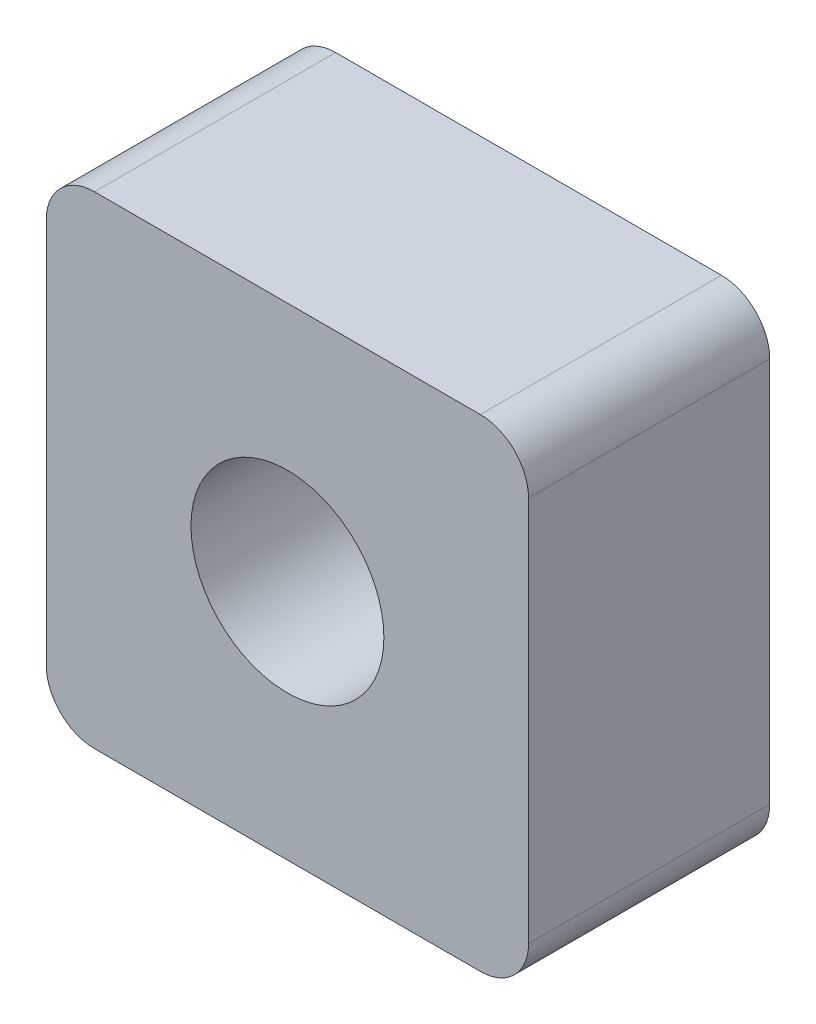
ISO-10303-21;
HEADER;
FILE_DESCRIPTION(('STEP AP214'),'2;1');
FILE_NAME('part.step','',(''),(''),'','','');
FILE_SCHEMA(('AUTOMOTIVE_DESIGN { 1 0 10303 214 1 1 1 1 }'));
ENDSEC;
DATA;
#1=APPLICATION_CONTEXT('core data for automotive mechanical design processes');
#2=APPLICATION_PROTOCOL_DEFINITION('international standard','automotive_design',2000,#1);
#3=PRODUCT_CONTEXT('',#1,'mechanical');
#4=PRODUCT('Part','Part','',(#3));
#5=PRODUCT_RELATED_PRODUCT_CATEGORY('part','',(#4));
#6=PRODUCT_DEFINITION_FORMATION('','',#4);
#7=PRODUCT_DEFINITION_CONTEXT('part definition',#1,'design');
#8=PRODUCT_DEFINITION('design','',#6,#7);
#9=PRODUCT_DEFINITION_SHAPE('','',#8);
#10=(LENGTH_UNIT() NAMED_UNIT(*) SI_UNIT(.MILLI.,.METRE.));
#11=(NAMED_UNIT(*) PLANE_ANGLE_UNIT() SI_UNIT($,.RADIAN.));
#12=(NAMED_UNIT(*) SI_UNIT($,.STERADIAN.) SOLID_ANGLE_UNIT());
#13=UNCERTAINTY_MEASURE_WITH_UNIT(LENGTH_MEASURE(1.E-05),#10,'distance_accuracy_value','');
#14=(GEOMETRIC_REPRESENTATION_CONTEXT(3) GLOBAL_UNCERTAINTY_ASSIGNED_CONTEXT((#13)) GLOBAL_UNIT_ASSIGNED_CONTEXT((#10,
#11,#12)) REPRESENTATION_CONTEXT('',''));
#15=CARTESIAN_POINT('',(0.,0.,0.));
#16=DIRECTION('',(0.,0.,1.));
#17=DIRECTION('',(1.,0.,0.));
#18=AXIS2_PLACEMENT_3D('',#15,#16,#17);
#19=CARTESIAN_POINT('',(0.,0.,10.));
#20=DIRECTION('',(0.,0.,1.));
#21=DIRECTION('',(1.,0.,0.));
#22=AXIS2_PLACEMENT_3D('',#19,#20,#21);
#23=PLANE('',#22);
#24=CARTESIAN_POINT('',(0.,0.,10.));
#25=DIRECTION('',(0.,0.,1.));
#26=DIRECTION('',(1.,0.,0.));
#27=AXIS2_PLACEMENT_3D('',#24,#25,#26);
#28=CIRCLE('',#27,4.);
#29=CARTESIAN_POINT('',(4.,0.,10.));
#30=VERTEX_POINT('',#29);
#31=EDGE_CURVE('E129',#30,#30,#28,.F.);
#32=ORIENTED_EDGE('',*,*,#31,.T.);
#33=EDGE_LOOP('',(#32));
#34=FACE_BOUND('',#33,.T.);
#35=DIRECTION('',(1.,0.,0.));
#36=VECTOR('',#35,1.);
#37=CARTESIAN_POINT('',(8.,-10.,10.));
#38=LINE('',#37,#36);
#39=CARTESIAN_POINT('',(8.,-10.,10.));
#40=VERTEX_POINT('',#39);
#41=CARTESIAN_POINT('',(-8.,-10.,10.));
#42=VERTEX_POINT('',#41);
#43=EDGE_CURVE('E113',#40,#42,#38,.F.);
#44=ORIENTED_EDGE('',*,*,#43,.F.);
#45=CARTESIAN_POINT('',(8.,-8.,10.));
#46=DIRECTION('',(0.,0.,1.));
#47=DIRECTION('',(1.,0.,0.));
#48=AXIS2_PLACEMENT_3D('',#45,#46,#47);
#49=CIRCLE('',#48,2.);
#50=CARTESIAN_POINT('',(10.,-8.,10.));
#51=VERTEX_POINT('',#50);
#52=EDGE_CURVE('E134',#51,#40,#49,.F.);
#53=ORIENTED_EDGE('',*,*,#52,.F.);
#54=DIRECTION('',(0.,1.,0.));
#55=VECTOR('',#54,1.);
#56=CARTESIAN_POINT('',(10.,8.,10.));
#57=LINE('',#56,#55);
#58=CARTESIAN_POINT('',(10.,8.,10.));
#59=VERTEX_POINT('',#58);
#60=EDGE_CURVE('E109',#59,#51,#57,.F.);
#61=ORIENTED_EDGE('',*,*,#60,.F.);
#62=CARTESIAN_POINT('',(8.,8.,10.));
#63=DIRECTION('',(0.,0.,1.));
#64=DIRECTION('',(1.,0.,0.));
#65=AXIS2_PLACEMENT_3D('',#62,#63,#64);
#66=CIRCLE('',#65,2.);
#67=CARTESIAN_POINT('',(8.,10.,10.));
#68=VERTEX_POINT('',#67);
#69=EDGE_CURVE('E96',#68,#59,#66,.F.);
#70=ORIENTED_EDGE('',*,*,#69,.F.);
#71=DIRECTION('',(1.,0.,0.));
#72=VECTOR('',#71,1.);
#73=CARTESIAN_POINT('',(-8.,10.,10.));
#74=LINE('',#73,#72);
#75=CARTESIAN_POINT('',(-8.,10.,10.));
#76=VERTEX_POINT('',#75);
#77=EDGE_CURVE('E92',#76,#68,#74,.T.);
#78=ORIENTED_EDGE('',*,*,#77,.F.);
#79=CARTESIAN_POINT('',(-8.,8.,10.));
#80=DIRECTION('',(0.,0.,1.));
#81=DIRECTION('',(1.,0.,0.));
#82=AXIS2_PLACEMENT_3D('',#79,#80,#81);
#83=CIRCLE('',#82,2.);
#84=CARTESIAN_POINT('',(-10.,8.,10.));
#85=VERTEX_POINT('',#84);
#86=EDGE_CURVE('E20',#85,#76,#83,.F.);
#87=ORIENTED_EDGE('',*,*,#86,.F.);
#88=DIRECTION('',(0.,1.,0.));
#89=VECTOR('',#88,1.);
#90=CARTESIAN_POINT('',(-10.,-8.,10.));
#91=LINE('',#90,#89);
#92=CARTESIAN_POINT('',(-10.,-8.,10.));
#93=VERTEX_POINT('',#92);
#94=EDGE_CURVE('E79',#93,#85,#91,.T.);
#95=ORIENTED_EDGE('',*,*,#94,.F.);
#96=CARTESIAN_POINT('',(-8.,-8.,10.));
#97=DIRECTION('',(0.,0.,1.));
#98=DIRECTION('',(1.,0.,0.));
#99=AXIS2_PLACEMENT_3D('',#96,#97,#98);
#100=CIRCLE('',#99,2.);
#101=EDGE_CURVE('E135',#42,#93,#100,.F.);
#102=ORIENTED_EDGE('',*,*,#101,.F.);
#103=EDGE_LOOP('',(#44,#53,#61,#70,#78,#87,#95,#102));
#104=FACE_BOUND('',#103,.T.);
#105=ADVANCED_FACE('F17',(#34,#104),#23,.T.);
#106=CARTESIAN_POINT('',(-8.,10.,0.));
#107=DIRECTION('',(0.,1.,0.));
#108=DIRECTION('',(0.,0.,1.));
#109=AXIS2_PLACEMENT_3D('',#106,#107,#108);
#110=PLANE('',#109);
#111=DIRECTION('',(1.,0.,0.));
#112=VECTOR('',#111,1.);
#113=CARTESIAN_POINT('',(0.,10.,0.));
#114=LINE('',#113,#112);
#115=CARTESIAN_POINT('',(8.,10.,0.));
#116=VERTEX_POINT('',#115);
#117=CARTESIAN_POINT('',(-8.,10.,0.));
#118=VERTEX_POINT('',#117);
#119=EDGE_CURVE('E103',#116,#118,#114,.F.);
#120=ORIENTED_EDGE('',*,*,#119,.T.);
#121=DIRECTION('',(0.,0.,1.));
#122=VECTOR('',#121,1.);
#123=CARTESIAN_POINT('',(-8.,10.,0.));
#124=LINE('',#123,#122);
#125=EDGE_CURVE('E88',#76,#118,#124,.F.);
#126=ORIENTED_EDGE('',*,*,#125,.F.);
#127=ORIENTED_EDGE('',*,*,#77,.T.);
#128=DIRECTION('',(0.,0.,1.));
#129=VECTOR('',#128,1.);
#130=CARTESIAN_POINT('',(8.,10.,0.));
#131=LINE('',#130,#129);
#132=EDGE_CURVE('E132',#116,#68,#131,.T.);
#133=ORIENTED_EDGE('',*,*,#132,.F.);
#134=EDGE_LOOP('',(#120,#126,#127,#133));
#135=FACE_BOUND('',#134,.T.);
#136=ADVANCED_FACE('F102',(#135),#110,.T.);
#137=CARTESIAN_POINT('',(-8.,8.,0.));
#138=DIRECTION('',(0.,0.,1.));
#139=DIRECTION('',(1.,0.,0.));
#140=AXIS2_PLACEMENT_3D('',#137,#138,#139);
#141=CYLINDRICAL_SURFACE('',#140,2.);
#142=CARTESIAN_POINT('',(-8.,8.,0.));
#143=DIRECTION('',(0.,0.,1.));
#144=DIRECTION('',(1.,0.,0.));
#145=AXIS2_PLACEMENT_3D('',#142,#143,#144);
#146=CIRCLE('',#145,2.);
#147=CARTESIAN_POINT('',(-10.,8.,0.));
#148=VERTEX_POINT('',#147);
#149=EDGE_CURVE('E127',#118,#148,#146,.T.);
#150=ORIENTED_EDGE('',*,*,#149,.T.);
#151=DIRECTION('',(0.,0.,1.));
#152=VECTOR('',#151,1.);
#153=CARTESIAN_POINT('',(-10.,8.,0.));
#154=LINE('',#153,#152);
#155=EDGE_CURVE('E90',#85,#148,#154,.F.);
#156=ORIENTED_EDGE('',*,*,#155,.F.);
#157=ORIENTED_EDGE('',*,*,#86,.T.);
#158=ORIENTED_EDGE('',*,*,#125,.T.);
#159=EDGE_LOOP('',(#150,#156,#157,#158));
#160=FACE_BOUND('',#159,.T.);
#161=ADVANCED_FACE('F86',(#160),#141,.T.);
#162=CARTESIAN_POINT('',(-10.,-8.,0.));
#163=DIRECTION('',(-1.,0.,0.));
#164=DIRECTION('',(0.,0.,1.));
#165=AXIS2_PLACEMENT_3D('',#162,#163,#164);
#166=PLANE('',#165);
#167=DIRECTION('',(0.,1.,0.));
#168=VECTOR('',#167,1.);
#169=CARTESIAN_POINT('',(-10.,0.,0.));
#170=LINE('',#169,#168);
#171=CARTESIAN_POINT('',(-10.,-8.,0.));
#172=VERTEX_POINT('',#171);
#173=EDGE_CURVE('E126',#148,#172,#170,.F.);
#174=ORIENTED_EDGE('',*,*,#173,.T.);
#175=DIRECTION('',(0.,0.,1.));
#176=VECTOR('',#175,1.);
#177=CARTESIAN_POINT('',(-10.,-8.,0.));
#178=LINE('',#177,#176);
#179=EDGE_CURVE('E115',#93,#172,#178,.F.);
#180=ORIENTED_EDGE('',*,*,#179,.F.);
#181=ORIENTED_EDGE('',*,*,#94,.T.);
#182=ORIENTED_EDGE('',*,*,#155,.T.);
#183=EDGE_LOOP('',(#174,#180,#181,#182));
#184=FACE_BOUND('',#183,.T.);
#185=ADVANCED_FACE('F141',(#184),#166,.T.);
#186=CARTESIAN_POINT('',(-8.,-8.,0.));
#187=DIRECTION('',(0.,0.,1.));
#188=DIRECTION('',(1.,0.,0.));
#189=AXIS2_PLACEMENT_3D('',#186,#187,#188);
#190=CYLINDRICAL_SURFACE('',#189,2.);
#191=CARTESIAN_POINT('',(-8.,-8.,0.));
#192=DIRECTION('',(0.,0.,1.));
#193=DIRECTION('',(1.,0.,0.));
#194=AXIS2_PLACEMENT_3D('',#191,#192,#193);
#195=CIRCLE('',#194,2.);
#196=CARTESIAN_POINT('',(-8.,-10.,0.));
#197=VERTEX_POINT('',#196);
#198=EDGE_CURVE('E123',#172,#197,#195,.T.);
#199=ORIENTED_EDGE('',*,*,#198,.T.);
#200=DIRECTION('',(0.,0.,-1.));
#201=VECTOR('',#200,1.);
#202=CARTESIAN_POINT('',(-8.,-10.,0.));
#203=LINE('',#202,#201);
#204=EDGE_CURVE('E114',#42,#197,#203,.T.);
#205=ORIENTED_EDGE('',*,*,#204,.F.);
#206=ORIENTED_EDGE('',*,*,#101,.T.);
#207=ORIENTED_EDGE('',*,*,#179,.T.);
#208=EDGE_LOOP('',(#199,#205,#206,#207));
#209=FACE_BOUND('',#208,.T.);
#210=ADVANCED_FACE('F161',(#209),#190,.T.);
#211=CARTESIAN_POINT('',(8.,-10.,0.));
#212=DIRECTION('',(0.,-1.,0.));
#213=DIRECTION('',(0.,0.,-1.));
#214=AXIS2_PLACEMENT_3D('',#211,#212,#213);
#215=PLANE('',#214);
#216=DIRECTION('',(1.,0.,0.));
#217=VECTOR('',#216,1.);
#218=CARTESIAN_POINT('',(0.,-10.,0.));
#219=LINE('',#218,#217);
#220=CARTESIAN_POINT('',(8.,-10.,0.));
#221=VERTEX_POINT('',#220);
#222=EDGE_CURVE('E122',#197,#221,#219,.T.);
#223=ORIENTED_EDGE('',*,*,#222,.T.);
#224=DIRECTION('',(0.,0.,1.));
#225=VECTOR('',#224,1.);
#226=CARTESIAN_POINT('',(8.,-10.,0.));
#227=LINE('',#226,#225);
#228=EDGE_CURVE('E112',#40,#221,#227,.F.);
#229=ORIENTED_EDGE('',*,*,#228,.F.);
#230=ORIENTED_EDGE('',*,*,#43,.T.);
#231=ORIENTED_EDGE('',*,*,#204,.T.);
#232=EDGE_LOOP('',(#223,#229,#230,#231));
#233=FACE_BOUND('',#232,.T.);
#234=ADVANCED_FACE('F158',(#233),#215,.T.);
#235=CARTESIAN_POINT('',(8.,-8.,0.));
#236=DIRECTION('',(0.,0.,1.));
#237=DIRECTION('',(1.,0.,0.));
#238=AXIS2_PLACEMENT_3D('',#235,#236,#237);
#239=CYLINDRICAL_SURFACE('',#238,2.);
#240=CARTESIAN_POINT('',(8.,-8.,0.));
#241=DIRECTION('',(0.,0.,1.));
#242=DIRECTION('',(1.,0.,0.));
#243=AXIS2_PLACEMENT_3D('',#240,#241,#242);
#244=CIRCLE('',#243,2.);
#245=CARTESIAN_POINT('',(10.,-8.,0.));
#246=VERTEX_POINT('',#245);
#247=EDGE_CURVE('E119',#221,#246,#244,.T.);
#248=ORIENTED_EDGE('',*,*,#247,.T.);
#249=DIRECTION('',(0.,0.,-1.));
#250=VECTOR('',#249,1.);
#251=CARTESIAN_POINT('',(10.,-8.,0.));
#252=LINE('',#251,#250);
#253=EDGE_CURVE('E111',#51,#246,#252,.T.);
#254=ORIENTED_EDGE('',*,*,#253,.F.);
#255=ORIENTED_EDGE('',*,*,#52,.T.);
#256=ORIENTED_EDGE('',*,*,#228,.T.);
#257=EDGE_LOOP('',(#248,#254,#255,#256));
#258=FACE_BOUND('',#257,.T.);
#259=ADVANCED_FACE('F169',(#258),#239,.T.);
#260=CARTESIAN_POINT('',(10.,8.,0.));
#261=DIRECTION('',(1.,0.,0.));
#262=DIRECTION('',(0.,0.,-1.));
#263=AXIS2_PLACEMENT_3D('',#260,#261,#262);
#264=PLANE('',#263);
#265=DIRECTION('',(0.,1.,0.));
#266=VECTOR('',#265,1.);
#267=CARTESIAN_POINT('',(10.,0.,0.));
#268=LINE('',#267,#266);
#269=CARTESIAN_POINT('',(10.,8.,0.));
#270=VERTEX_POINT('',#269);
#271=EDGE_CURVE('E118',#246,#270,#268,.T.);
#272=ORIENTED_EDGE('',*,*,#271,.T.);
#273=DIRECTION('',(0.,0.,1.));
#274=VECTOR('',#273,1.);
#275=CARTESIAN_POINT('',(10.,8.,0.));
#276=LINE('',#275,#274);
#277=EDGE_CURVE('E35',#59,#270,#276,.F.);
#278=ORIENTED_EDGE('',*,*,#277,.F.);
#279=ORIENTED_EDGE('',*,*,#60,.T.);
#280=ORIENTED_EDGE('',*,*,#253,.T.);
#281=EDGE_LOOP('',(#272,#278,#279,#280));
#282=FACE_BOUND('',#281,.T.);
#283=ADVANCED_FACE('F186',(#282),#264,.T.);
#284=CARTESIAN_POINT('',(8.,8.,0.));
#285=DIRECTION('',(0.,0.,1.));
#286=DIRECTION('',(1.,0.,0.));
#287=AXIS2_PLACEMENT_3D('',#284,#285,#286);
#288=CYLINDRICAL_SURFACE('',#287,2.);
#289=CARTESIAN_POINT('',(8.,8.,0.));
#290=DIRECTION('',(0.,0.,1.));
#291=DIRECTION('',(1.,0.,0.));
#292=AXIS2_PLACEMENT_3D('',#289,#290,#291);
#293=CIRCLE('',#292,2.);
#294=EDGE_CURVE('E26',#270,#116,#293,.T.);
#295=ORIENTED_EDGE('',*,*,#294,.T.);
#296=ORIENTED_EDGE('',*,*,#132,.T.);
#297=ORIENTED_EDGE('',*,*,#69,.T.);
#298=ORIENTED_EDGE('',*,*,#277,.T.);
#299=EDGE_LOOP('',(#295,#296,#297,#298));
#300=FACE_BOUND('',#299,.T.);
#301=ADVANCED_FACE('F179',(#300),#288,.T.);
#302=CARTESIAN_POINT('',(0.,0.,0.));
#303=DIRECTION('',(0.,0.,1.));
#304=DIRECTION('',(1.,0.,0.));
#305=AXIS2_PLACEMENT_3D('',#302,#303,#304);
#306=CYLINDRICAL_SURFACE('',#305,4.);
#307=CARTESIAN_POINT('',(0.,0.,0.));
#308=DIRECTION('',(0.,0.,1.));
#309=DIRECTION('',(1.,0.,0.));
#310=AXIS2_PLACEMENT_3D('',#307,#308,#309);
#311=CIRCLE('',#310,4.);
#312=CARTESIAN_POINT('',(4.,0.,0.));
#313=VERTEX_POINT('',#312);
#314=EDGE_CURVE('E11',#313,#313,#311,.F.);
#315=ORIENTED_EDGE('',*,*,#314,.T.);
#316=EDGE_LOOP('',(#315));
#317=FACE_BOUND('',#316,.T.);
#318=ORIENTED_EDGE('',*,*,#31,.F.);
#319=EDGE_LOOP('',(#318));
#320=FACE_BOUND('',#319,.T.);
#321=ADVANCED_FACE('F173',(#317,#320),#306,.F.);
#322=CARTESIAN_POINT('',(0.,0.,0.));
#323=DIRECTION('',(0.,0.,1.));
#324=DIRECTION('',(1.,0.,0.));
#325=AXIS2_PLACEMENT_3D('',#322,#323,#324);
#326=PLANE('',#325);
#327=ORIENTED_EDGE('',*,*,#314,.F.);
#328=EDGE_LOOP('',(#327));
#329=FACE_BOUND('',#328,.T.);
#330=ORIENTED_EDGE('',*,*,#271,.F.);
#331=ORIENTED_EDGE('',*,*,#247,.F.);
#332=ORIENTED_EDGE('',*,*,#222,.F.);
#333=ORIENTED_EDGE('',*,*,#198,.F.);
#334=ORIENTED_EDGE('',*,*,#173,.F.);
#335=ORIENTED_EDGE('',*,*,#149,.F.);
#336=ORIENTED_EDGE('',*,*,#119,.F.);
#337=ORIENTED_EDGE('',*,*,#294,.F.);
#338=EDGE_LOOP('',(#330,#331,#332,#333,#334,#335,#336,#337));
#339=FACE_BOUND('',#338,.T.);
#340=ADVANCED_FACE('F145',(#329,#339),#326,.F.);
#341=CLOSED_SHELL('',(#105,#136,#161,#185,#210,#234,#259,#283,#301,#321,#340));
#342=MANIFOLD_SOLID_BREP('B1',#341);
#343=ADVANCED_BREP_SHAPE_REPRESENTATION('',(#18,#342),#14);
#344=SHAPE_DEFINITION_REPRESENTATION(#9,#343);
ENDSEC;
END-ISO-10303-21;
